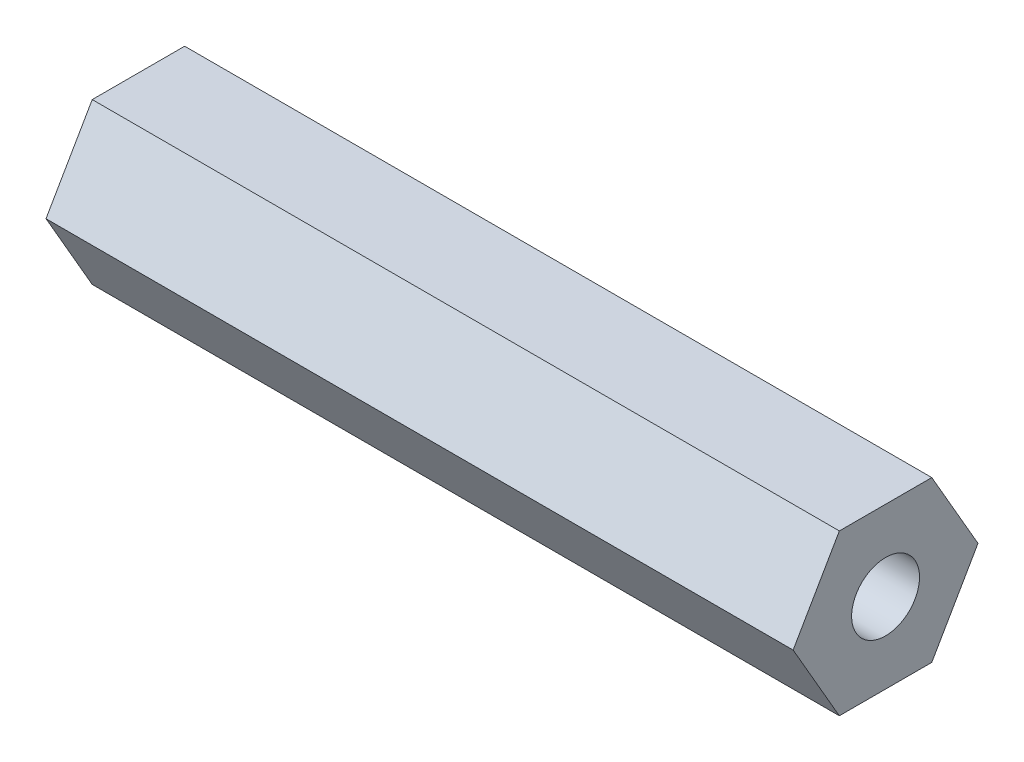
ISO-10303-21;
HEADER;
FILE_DESCRIPTION(('STEP AP214'),'2;1');
FILE_NAME('part.step','',(''),(''),'','','');
FILE_SCHEMA(('AUTOMOTIVE_DESIGN { 1 0 10303 214 1 1 1 1 }'));
ENDSEC;
DATA;
#1=APPLICATION_CONTEXT('core data for automotive mechanical design processes');
#2=APPLICATION_PROTOCOL_DEFINITION('international standard','automotive_design',2000,#1);
#3=PRODUCT_CONTEXT('',#1,'mechanical');
#4=PRODUCT('Part','Part','',(#3));
#5=PRODUCT_RELATED_PRODUCT_CATEGORY('part','',(#4));
#6=PRODUCT_DEFINITION_FORMATION('','',#4);
#7=PRODUCT_DEFINITION_CONTEXT('part definition',#1,'design');
#8=PRODUCT_DEFINITION('design','',#6,#7);
#9=PRODUCT_DEFINITION_SHAPE('','',#8);
#10=(LENGTH_UNIT() NAMED_UNIT(*) SI_UNIT(.MILLI.,.METRE.));
#11=(NAMED_UNIT(*) PLANE_ANGLE_UNIT() SI_UNIT($,.RADIAN.));
#12=(NAMED_UNIT(*) SI_UNIT($,.STERADIAN.) SOLID_ANGLE_UNIT());
#13=UNCERTAINTY_MEASURE_WITH_UNIT(LENGTH_MEASURE(1.E-05),#10,'distance_accuracy_value','');
#14=(GEOMETRIC_REPRESENTATION_CONTEXT(3) GLOBAL_UNCERTAINTY_ASSIGNED_CONTEXT((#13)) GLOBAL_UNIT_ASSIGNED_CONTEXT((#10,
#11,#12)) REPRESENTATION_CONTEXT('',''));
#15=CARTESIAN_POINT('',(0.,0.,0.));
#16=DIRECTION('',(0.,0.,1.));
#17=DIRECTION('',(1.,0.,0.));
#18=AXIS2_PLACEMENT_3D('',#15,#16,#17);
#19=CARTESIAN_POINT('',(38.1,0.,0.));
#20=DIRECTION('',(1.,0.,0.));
#21=DIRECTION('',(0.,1.,0.));
#22=AXIS2_PLACEMENT_3D('',#19,#20,#21);
#23=PLANE('',#22);
#24=CARTESIAN_POINT('',(38.1,0.,0.));
#25=DIRECTION('',(1.,0.,0.));
#26=DIRECTION('',(0.,0.,-1.));
#27=AXIS2_PLACEMENT_3D('',#24,#25,#26);
#28=CIRCLE('',#27,2.0193);
#29=CARTESIAN_POINT('',(38.1,0.,-2.0193));
#30=VERTEX_POINT('',#29);
#31=EDGE_CURVE('E44',#30,#30,#28,.T.);
#32=ORIENTED_EDGE('',*,*,#31,.F.);
#33=EDGE_LOOP('',(#32));
#34=FACE_BOUND('',#33,.T.);
#35=DIRECTION('',(0.,0.866025403784442,-0.5));
#36=VECTOR('',#35,1.);
#37=CARTESIAN_POINT('',(38.1,-4.7625,-2.74963065701564));
#38=LINE('',#37,#36);
#39=CARTESIAN_POINT('',(38.1,-4.7625,-2.74963065701564));
#40=VERTEX_POINT('',#39);
#41=CARTESIAN_POINT('',(38.1,0.,-5.49926131403117));
#42=VERTEX_POINT('',#41);
#43=EDGE_CURVE('E158',#40,#42,#38,.T.);
#44=ORIENTED_EDGE('',*,*,#43,.T.);
#45=DIRECTION('',(0.,0.866025403784438,0.5));
#46=VECTOR('',#45,1.);
#47=CARTESIAN_POINT('',(38.1,0.,-5.49926131403117));
#48=LINE('',#47,#46);
#49=CARTESIAN_POINT('',(38.1,4.7625,-2.74963065701557));
#50=VERTEX_POINT('',#49);
#51=EDGE_CURVE('E93',#42,#50,#48,.T.);
#52=ORIENTED_EDGE('',*,*,#51,.T.);
#53=DIRECTION('',(0.,0.,1.));
#54=VECTOR('',#53,1.);
#55=CARTESIAN_POINT('',(38.1,4.7625,-2.74963065701557));
#56=LINE('',#55,#54);
#57=CARTESIAN_POINT('',(38.1,4.7625,2.7496306570156));
#58=VERTEX_POINT('',#57);
#59=EDGE_CURVE('E133',#50,#58,#56,.T.);
#60=ORIENTED_EDGE('',*,*,#59,.T.);
#61=DIRECTION('',(0.,-0.866025403784442,0.5));
#62=VECTOR('',#61,1.);
#63=CARTESIAN_POINT('',(38.1,4.7625,2.7496306570156));
#64=LINE('',#63,#62);
#65=CARTESIAN_POINT('',(38.1,0.,5.49926131403117));
#66=VERTEX_POINT('',#65);
#67=EDGE_CURVE('E130',#58,#66,#64,.T.);
#68=ORIENTED_EDGE('',*,*,#67,.T.);
#69=DIRECTION('',(0.,-0.866025403784435,-0.500000000000007));
#70=VECTOR('',#69,1.);
#71=CARTESIAN_POINT('',(38.1,0.,5.49926131403117));
#72=LINE('',#71,#70);
#73=CARTESIAN_POINT('',(38.1,-4.7625,2.74963065701554));
#74=VERTEX_POINT('',#73);
#75=EDGE_CURVE('E50',#66,#74,#72,.T.);
#76=ORIENTED_EDGE('',*,*,#75,.T.);
#77=DIRECTION('',(0.,0.,-1.));
#78=VECTOR('',#77,1.);
#79=CARTESIAN_POINT('',(38.1,-4.7625,2.74963065701554));
#80=LINE('',#79,#78);
#81=EDGE_CURVE('E11',#74,#40,#80,.T.);
#82=ORIENTED_EDGE('',*,*,#81,.T.);
#83=EDGE_LOOP('',(#44,#52,#60,#68,#76,#82));
#84=FACE_BOUND('',#83,.T.);
#85=ADVANCED_FACE('F40',(#34,#84),#23,.T.);
#86=CARTESIAN_POINT('',(38.1,-4.7625,2.74963065701554));
#87=DIRECTION('',(0.,1.,0.));
#88=DIRECTION('',(0.,0.,-1.));
#89=AXIS2_PLACEMENT_3D('',#86,#87,#88);
#90=PLANE('',#89);
#91=DIRECTION('',(-1.,0.,0.));
#92=VECTOR('',#91,1.);
#93=CARTESIAN_POINT('',(38.1,-4.7625,2.74963065701554));
#94=LINE('',#93,#92);
#95=CARTESIAN_POINT('',(-6.35,-4.76250000000003,2.74963065701553));
#96=VERTEX_POINT('',#95);
#97=EDGE_CURVE('E149',#74,#96,#94,.T.);
#98=ORIENTED_EDGE('',*,*,#97,.T.);
#99=DIRECTION('',(0.,0.,-1.));
#100=VECTOR('',#99,1.);
#101=CARTESIAN_POINT('',(-6.35,-4.7625,-5.49926131403119));
#102=LINE('',#101,#100);
#103=CARTESIAN_POINT('',(-6.35,-4.76250000000001,-2.74963065701564));
#104=VERTEX_POINT('',#103);
#105=EDGE_CURVE('E126',#96,#104,#102,.T.);
#106=ORIENTED_EDGE('',*,*,#105,.T.);
#107=DIRECTION('',(-1.,0.,0.));
#108=VECTOR('',#107,1.);
#109=CARTESIAN_POINT('',(38.1,-4.7625,-2.74963065701564));
#110=LINE('',#109,#108);
#111=EDGE_CURVE('E148',#40,#104,#110,.T.);
#112=ORIENTED_EDGE('',*,*,#111,.F.);
#113=ORIENTED_EDGE('',*,*,#81,.F.);
#114=EDGE_LOOP('',(#98,#106,#112,#113));
#115=FACE_BOUND('',#114,.T.);
#116=ADVANCED_FACE('F166',(#115),#90,.F.);
#117=CARTESIAN_POINT('',(38.1,0.,5.49926131403117));
#118=DIRECTION('',(0.,0.500000000000007,-0.866025403784435));
#119=DIRECTION('',(-1.,0.,0.));
#120=AXIS2_PLACEMENT_3D('',#117,#118,#119);
#121=PLANE('',#120);
#122=DIRECTION('',(-1.,0.,0.));
#123=VECTOR('',#122,1.);
#124=CARTESIAN_POINT('',(38.1,0.,5.49926131403117));
#125=LINE('',#124,#123);
#126=CARTESIAN_POINT('',(-6.35,0.,5.49926131403117));
#127=VERTEX_POINT('',#126);
#128=EDGE_CURVE('E139',#66,#127,#125,.T.);
#129=ORIENTED_EDGE('',*,*,#128,.T.);
#130=DIRECTION('',(0.,-0.866025403784435,-0.500000000000007));
#131=VECTOR('',#130,1.);
#132=CARTESIAN_POINT('',(-6.35,0.,5.49926131403117));
#133=LINE('',#132,#131);
#134=EDGE_CURVE('E114',#127,#96,#133,.T.);
#135=ORIENTED_EDGE('',*,*,#134,.T.);
#136=ORIENTED_EDGE('',*,*,#97,.F.);
#137=ORIENTED_EDGE('',*,*,#75,.F.);
#138=EDGE_LOOP('',(#129,#135,#136,#137));
#139=FACE_BOUND('',#138,.T.);
#140=ADVANCED_FACE('F42',(#139),#121,.F.);
#141=CARTESIAN_POINT('',(38.1,4.7625,2.7496306570156));
#142=DIRECTION('',(0.,-0.5,-0.866025403784442));
#143=DIRECTION('',(0.,-0.866025403784442,0.5));
#144=AXIS2_PLACEMENT_3D('',#141,#142,#143);
#145=PLANE('',#144);
#146=DIRECTION('',(-1.,0.,0.));
#147=VECTOR('',#146,1.);
#148=CARTESIAN_POINT('',(38.1,4.7625,2.7496306570156));
#149=LINE('',#148,#147);
#150=CARTESIAN_POINT('',(-6.35,4.76249999999998,2.7496306570156));
#151=VERTEX_POINT('',#150);
#152=EDGE_CURVE('E124',#58,#151,#149,.T.);
#153=ORIENTED_EDGE('',*,*,#152,.T.);
#154=DIRECTION('',(0.,-0.866025403784439,0.499999999999999));
#155=VECTOR('',#154,1.);
#156=CARTESIAN_POINT('',(-6.35,4.7625,2.7496306570156));
#157=LINE('',#156,#155);
#158=EDGE_CURVE('E109',#151,#127,#157,.T.);
#159=ORIENTED_EDGE('',*,*,#158,.T.);
#160=ORIENTED_EDGE('',*,*,#128,.F.);
#161=ORIENTED_EDGE('',*,*,#67,.F.);
#162=EDGE_LOOP('',(#153,#159,#160,#161));
#163=FACE_BOUND('',#162,.T.);
#164=ADVANCED_FACE('F128',(#163),#145,.F.);
#165=CARTESIAN_POINT('',(38.1,4.7625,-2.74963065701557));
#166=DIRECTION('',(0.,-1.,0.));
#167=DIRECTION('',(0.,0.,-1.));
#168=AXIS2_PLACEMENT_3D('',#165,#166,#167);
#169=PLANE('',#168);
#170=DIRECTION('',(-1.,0.,0.));
#171=VECTOR('',#170,1.);
#172=CARTESIAN_POINT('',(38.1,4.7625,-2.74963065701557));
#173=LINE('',#172,#171);
#174=CARTESIAN_POINT('',(-6.35,4.7625,-2.74963065701558));
#175=VERTEX_POINT('',#174);
#176=EDGE_CURVE('E125',#50,#175,#173,.T.);
#177=ORIENTED_EDGE('',*,*,#176,.T.);
#178=DIRECTION('',(0.,0.,-1.));
#179=VECTOR('',#178,1.);
#180=CARTESIAN_POINT('',(-6.35,4.76250000000001,-5.49926131403115));
#181=LINE('',#180,#179);
#182=EDGE_CURVE('E112',#151,#175,#181,.T.);
#183=ORIENTED_EDGE('',*,*,#182,.F.);
#184=ORIENTED_EDGE('',*,*,#152,.F.);
#185=ORIENTED_EDGE('',*,*,#59,.F.);
#186=EDGE_LOOP('',(#177,#183,#184,#185));
#187=FACE_BOUND('',#186,.T.);
#188=ADVANCED_FACE('F123',(#187),#169,.F.);
#189=CARTESIAN_POINT('',(38.1,0.,-5.49926131403117));
#190=DIRECTION('',(0.,-0.5,0.866025403784438));
#191=DIRECTION('',(-1.,0.,0.));
#192=AXIS2_PLACEMENT_3D('',#189,#190,#191);
#193=PLANE('',#192);
#194=DIRECTION('',(-1.,0.,0.));
#195=VECTOR('',#194,1.);
#196=CARTESIAN_POINT('',(38.1,0.,-5.49926131403117));
#197=LINE('',#196,#195);
#198=CARTESIAN_POINT('',(-6.35,0.,-5.49926131403117));
#199=VERTEX_POINT('',#198);
#200=EDGE_CURVE('E145',#42,#199,#197,.T.);
#201=ORIENTED_EDGE('',*,*,#200,.T.);
#202=DIRECTION('',(0.,0.866025403784438,0.5));
#203=VECTOR('',#202,1.);
#204=CARTESIAN_POINT('',(-6.35,0.,-5.49926131403117));
#205=LINE('',#204,#203);
#206=EDGE_CURVE('E58',#199,#175,#205,.T.);
#207=ORIENTED_EDGE('',*,*,#206,.T.);
#208=ORIENTED_EDGE('',*,*,#176,.F.);
#209=ORIENTED_EDGE('',*,*,#51,.F.);
#210=EDGE_LOOP('',(#201,#207,#208,#209));
#211=FACE_BOUND('',#210,.T.);
#212=ADVANCED_FACE('F181',(#211),#193,.F.);
#213=CARTESIAN_POINT('',(38.1,-4.7625,-2.74963065701564));
#214=DIRECTION('',(0.,0.5,0.866025403784442));
#215=DIRECTION('',(1.,0.,0.));
#216=AXIS2_PLACEMENT_3D('',#213,#214,#215);
#217=PLANE('',#216);
#218=ORIENTED_EDGE('',*,*,#111,.T.);
#219=DIRECTION('',(0.,0.866025403784439,-0.499999999999999));
#220=VECTOR('',#219,1.);
#221=CARTESIAN_POINT('',(-6.35,-4.7625,-2.74963065701564));
#222=LINE('',#221,#220);
#223=EDGE_CURVE('E169',#104,#199,#222,.T.);
#224=ORIENTED_EDGE('',*,*,#223,.T.);
#225=ORIENTED_EDGE('',*,*,#200,.F.);
#226=ORIENTED_EDGE('',*,*,#43,.F.);
#227=EDGE_LOOP('',(#218,#224,#225,#226));
#228=FACE_BOUND('',#227,.T.);
#229=ADVANCED_FACE('F172',(#228),#217,.F.);
#230=CARTESIAN_POINT('',(38.1,0.,0.));
#231=DIRECTION('',(1.,0.,0.));
#232=DIRECTION('',(0.,0.,-1.));
#233=AXIS2_PLACEMENT_3D('',#230,#231,#232);
#234=CYLINDRICAL_SURFACE('',#233,2.0193);
#235=ORIENTED_EDGE('',*,*,#31,.T.);
#236=EDGE_LOOP('',(#235));
#237=FACE_BOUND('',#236,.T.);
#238=CARTESIAN_POINT('',(-6.35,0.,0.));
#239=DIRECTION('',(-1.,0.,0.));
#240=DIRECTION('',(0.,0.,1.));
#241=AXIS2_PLACEMENT_3D('',#238,#239,#240);
#242=CIRCLE('',#241,2.0193);
#243=CARTESIAN_POINT('',(-6.35,0.,2.0193));
#244=VERTEX_POINT('',#243);
#245=EDGE_CURVE('E152',#244,#244,#242,.T.);
#246=ORIENTED_EDGE('',*,*,#245,.T.);
#247=EDGE_LOOP('',(#246));
#248=FACE_BOUND('',#247,.T.);
#249=ADVANCED_FACE('F188',(#237,#248),#234,.F.);
#250=CARTESIAN_POINT('',(-6.35,-4.7625,-5.49926131403119));
#251=DIRECTION('',(1.,0.,0.));
#252=DIRECTION('',(0.,0.,-1.));
#253=AXIS2_PLACEMENT_3D('',#250,#251,#252);
#254=PLANE('',#253);
#255=ORIENTED_EDGE('',*,*,#245,.F.);
#256=EDGE_LOOP('',(#255));
#257=FACE_BOUND('',#256,.T.);
#258=ORIENTED_EDGE('',*,*,#158,.F.);
#259=ORIENTED_EDGE('',*,*,#182,.T.);
#260=ORIENTED_EDGE('',*,*,#206,.F.);
#261=ORIENTED_EDGE('',*,*,#223,.F.);
#262=ORIENTED_EDGE('',*,*,#105,.F.);
#263=ORIENTED_EDGE('',*,*,#134,.F.);
#264=EDGE_LOOP('',(#258,#259,#260,#261,#262,#263));
#265=FACE_BOUND('',#264,.T.);
#266=ADVANCED_FACE('F111',(#257,#265),#254,.F.);
#267=CLOSED_SHELL('',(#85,#116,#140,#164,#188,#212,#229,#249,#266));
#268=MANIFOLD_SOLID_BREP('B2',#267);
#269=ADVANCED_BREP_SHAPE_REPRESENTATION('',(#18,#268),#14);
#270=SHAPE_DEFINITION_REPRESENTATION(#9,#269);
ENDSEC;
END-ISO-10303-21;
